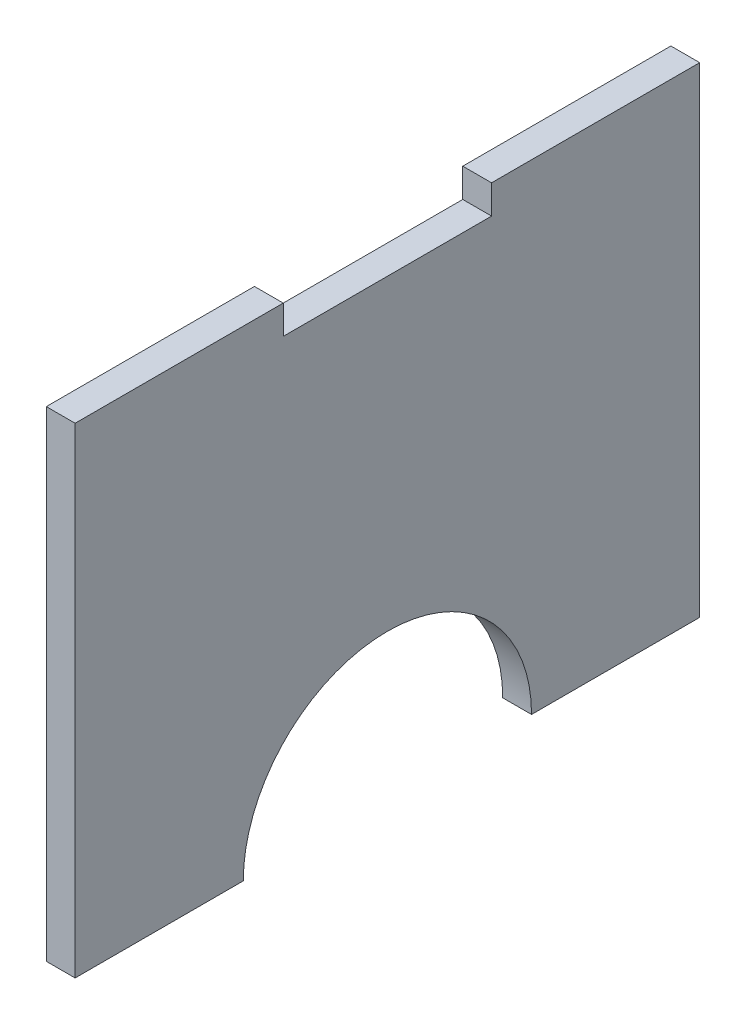
ISO-10303-21;
HEADER;
FILE_DESCRIPTION(('STEP AP214'),'2;1');
FILE_NAME('part.step','',(''),(''),'','','');
FILE_SCHEMA(('AUTOMOTIVE_DESIGN { 1 0 10303 214 1 1 1 1 }'));
ENDSEC;
DATA;
#1=APPLICATION_CONTEXT('core data for automotive mechanical design processes');
#2=APPLICATION_PROTOCOL_DEFINITION('international standard','automotive_design',2000,#1);
#3=PRODUCT_CONTEXT('',#1,'mechanical');
#4=PRODUCT('Part','Part','',(#3));
#5=PRODUCT_RELATED_PRODUCT_CATEGORY('part','',(#4));
#6=PRODUCT_DEFINITION_FORMATION('','',#4);
#7=PRODUCT_DEFINITION_CONTEXT('part definition',#1,'design');
#8=PRODUCT_DEFINITION('design','',#6,#7);
#9=PRODUCT_DEFINITION_SHAPE('','',#8);
#10=(LENGTH_UNIT() NAMED_UNIT(*) SI_UNIT(.MILLI.,.METRE.));
#11=(NAMED_UNIT(*) PLANE_ANGLE_UNIT() SI_UNIT($,.RADIAN.));
#12=(NAMED_UNIT(*) SI_UNIT($,.STERADIAN.) SOLID_ANGLE_UNIT());
#13=UNCERTAINTY_MEASURE_WITH_UNIT(LENGTH_MEASURE(1.E-05),#10,'distance_accuracy_value','');
#14=(GEOMETRIC_REPRESENTATION_CONTEXT(3) GLOBAL_UNCERTAINTY_ASSIGNED_CONTEXT((#13)) GLOBAL_UNIT_ASSIGNED_CONTEXT((#10,
#11,#12)) REPRESENTATION_CONTEXT('',''));
#15=CARTESIAN_POINT('',(0.,0.,0.));
#16=DIRECTION('',(0.,0.,1.));
#17=DIRECTION('',(1.,0.,0.));
#18=AXIS2_PLACEMENT_3D('',#15,#16,#17);
#19=CARTESIAN_POINT('',(3.,50.,32.5));
#20=DIRECTION('',(0.,-1.,0.));
#21=DIRECTION('',(0.,0.,-1.));
#22=AXIS2_PLACEMENT_3D('',#19,#20,#21);
#23=PLANE('',#22);
#24=DIRECTION('',(0.,0.,1.));
#25=VECTOR('',#24,1.);
#26=CARTESIAN_POINT('',(0.,50.,32.5));
#27=LINE('',#26,#25);
#28=CARTESIAN_POINT('',(0.,50.,10.84));
#29=VERTEX_POINT('',#28);
#30=CARTESIAN_POINT('',(0.,50.,32.5));
#31=VERTEX_POINT('',#30);
#32=EDGE_CURVE('E141',#29,#31,#27,.T.);
#33=ORIENTED_EDGE('',*,*,#32,.T.);
#34=DIRECTION('',(-1.,0.,0.));
#35=VECTOR('',#34,1.);
#36=CARTESIAN_POINT('',(3.,50.,32.5));
#37=LINE('',#36,#35);
#38=CARTESIAN_POINT('',(3.,50.,32.5));
#39=VERTEX_POINT('',#38);
#40=EDGE_CURVE('E11',#39,#31,#37,.T.);
#41=ORIENTED_EDGE('',*,*,#40,.F.);
#42=DIRECTION('',(0.,0.,1.));
#43=VECTOR('',#42,1.);
#44=CARTESIAN_POINT('',(3.,50.,32.5));
#45=LINE('',#44,#43);
#46=CARTESIAN_POINT('',(3.,50.,10.84));
#47=VERTEX_POINT('',#46);
#48=EDGE_CURVE('E159',#47,#39,#45,.T.);
#49=ORIENTED_EDGE('',*,*,#48,.F.);
#50=DIRECTION('',(-1.,0.,0.));
#51=VECTOR('',#50,1.);
#52=CARTESIAN_POINT('',(3.,50.,10.84));
#53=LINE('',#52,#51);
#54=EDGE_CURVE('E137',#47,#29,#53,.T.);
#55=ORIENTED_EDGE('',*,*,#54,.T.);
#56=EDGE_LOOP('',(#33,#41,#49,#55));
#57=FACE_BOUND('',#56,.T.);
#58=ADVANCED_FACE('F33',(#57),#23,.F.);
#59=CARTESIAN_POINT('',(3.,50.,32.5));
#60=DIRECTION('',(0.,0.,-1.));
#61=DIRECTION('',(-1.,0.,0.));
#62=AXIS2_PLACEMENT_3D('',#59,#60,#61);
#63=PLANE('',#62);
#64=DIRECTION('',(0.,-1.,0.));
#65=VECTOR('',#64,1.);
#66=CARTESIAN_POINT('',(0.,50.,32.5));
#67=LINE('',#66,#65);
#68=CARTESIAN_POINT('',(0.,0.,32.5));
#69=VERTEX_POINT('',#68);
#70=EDGE_CURVE('E144',#31,#69,#67,.T.);
#71=ORIENTED_EDGE('',*,*,#70,.T.);
#72=DIRECTION('',(-1.,0.,0.));
#73=VECTOR('',#72,1.);
#74=CARTESIAN_POINT('',(3.,0.,32.5));
#75=LINE('',#74,#73);
#76=CARTESIAN_POINT('',(3.,0.,32.5));
#77=VERTEX_POINT('',#76);
#78=EDGE_CURVE('E41',#77,#69,#75,.T.);
#79=ORIENTED_EDGE('',*,*,#78,.F.);
#80=DIRECTION('',(0.,-1.,0.));
#81=VECTOR('',#80,1.);
#82=CARTESIAN_POINT('',(3.,50.,32.5));
#83=LINE('',#82,#81);
#84=EDGE_CURVE('E98',#39,#77,#83,.T.);
#85=ORIENTED_EDGE('',*,*,#84,.F.);
#86=ORIENTED_EDGE('',*,*,#40,.T.);
#87=EDGE_LOOP('',(#71,#79,#85,#86));
#88=FACE_BOUND('',#87,.T.);
#89=ADVANCED_FACE('F208',(#88),#63,.F.);
#90=CARTESIAN_POINT('',(3.,0.,32.5));
#91=DIRECTION('',(0.,1.,0.));
#92=DIRECTION('',(0.,0.,1.));
#93=AXIS2_PLACEMENT_3D('',#90,#91,#92);
#94=PLANE('',#93);
#95=DIRECTION('',(0.,0.,-1.));
#96=VECTOR('',#95,1.);
#97=CARTESIAN_POINT('',(0.,0.,32.5));
#98=LINE('',#97,#96);
#99=CARTESIAN_POINT('',(0.,0.,15.));
#100=VERTEX_POINT('',#99);
#101=EDGE_CURVE('E146',#69,#100,#98,.T.);
#102=ORIENTED_EDGE('',*,*,#101,.T.);
#103=DIRECTION('',(-1.,0.,0.));
#104=VECTOR('',#103,1.);
#105=CARTESIAN_POINT('',(3.,0.,15.));
#106=LINE('',#105,#104);
#107=CARTESIAN_POINT('',(3.,0.,15.));
#108=VERTEX_POINT('',#107);
#109=EDGE_CURVE('E172',#108,#100,#106,.T.);
#110=ORIENTED_EDGE('',*,*,#109,.F.);
#111=DIRECTION('',(0.,0.,-1.));
#112=VECTOR('',#111,1.);
#113=CARTESIAN_POINT('',(3.,0.,32.5));
#114=LINE('',#113,#112);
#115=EDGE_CURVE('E180',#77,#108,#114,.T.);
#116=ORIENTED_EDGE('',*,*,#115,.F.);
#117=ORIENTED_EDGE('',*,*,#78,.T.);
#118=EDGE_LOOP('',(#102,#110,#116,#117));
#119=FACE_BOUND('',#118,.T.);
#120=ADVANCED_FACE('F178',(#119),#94,.F.);
#121=CARTESIAN_POINT('',(3.,0.,0.));
#122=DIRECTION('',(-1.,0.,0.));
#123=DIRECTION('',(0.,0.,1.));
#124=AXIS2_PLACEMENT_3D('',#121,#122,#123);
#125=CYLINDRICAL_SURFACE('',#124,15.);
#126=CARTESIAN_POINT('',(0.,0.,0.));
#127=DIRECTION('',(-1.,0.,0.));
#128=DIRECTION('',(0.,0.,1.));
#129=AXIS2_PLACEMENT_3D('',#126,#127,#128);
#130=CIRCLE('',#129,15.);
#131=CARTESIAN_POINT('',(0.,0.,-15.));
#132=VERTEX_POINT('',#131);
#133=EDGE_CURVE('E148',#100,#132,#130,.T.);
#134=ORIENTED_EDGE('',*,*,#133,.T.);
#135=DIRECTION('',(-1.,0.,0.));
#136=VECTOR('',#135,1.);
#137=CARTESIAN_POINT('',(3.,0.,-15.));
#138=LINE('',#137,#136);
#139=CARTESIAN_POINT('',(3.,0.,-15.));
#140=VERTEX_POINT('',#139);
#141=EDGE_CURVE('E169',#140,#132,#138,.T.);
#142=ORIENTED_EDGE('',*,*,#141,.F.);
#143=CARTESIAN_POINT('',(3.,0.,0.));
#144=DIRECTION('',(-1.,0.,0.));
#145=DIRECTION('',(0.,0.,1.));
#146=AXIS2_PLACEMENT_3D('',#143,#144,#145);
#147=CIRCLE('',#146,15.);
#148=EDGE_CURVE('E198',#108,#140,#147,.T.);
#149=ORIENTED_EDGE('',*,*,#148,.F.);
#150=ORIENTED_EDGE('',*,*,#109,.T.);
#151=EDGE_LOOP('',(#134,#142,#149,#150));
#152=FACE_BOUND('',#151,.T.);
#153=ADVANCED_FACE('F189',(#152),#125,.F.);
#154=CARTESIAN_POINT('',(3.,0.,-32.5));
#155=DIRECTION('',(0.,1.,0.));
#156=DIRECTION('',(0.,0.,1.));
#157=AXIS2_PLACEMENT_3D('',#154,#155,#156);
#158=PLANE('',#157);
#159=DIRECTION('',(0.,0.,-1.));
#160=VECTOR('',#159,1.);
#161=CARTESIAN_POINT('',(0.,0.,-32.5));
#162=LINE('',#161,#160);
#163=CARTESIAN_POINT('',(0.,0.,-32.5));
#164=VERTEX_POINT('',#163);
#165=EDGE_CURVE('E150',#132,#164,#162,.T.);
#166=ORIENTED_EDGE('',*,*,#165,.T.);
#167=DIRECTION('',(-1.,0.,0.));
#168=VECTOR('',#167,1.);
#169=CARTESIAN_POINT('',(3.,0.,-32.5));
#170=LINE('',#169,#168);
#171=CARTESIAN_POINT('',(3.,0.,-32.5));
#172=VERTEX_POINT('',#171);
#173=EDGE_CURVE('E166',#172,#164,#170,.T.);
#174=ORIENTED_EDGE('',*,*,#173,.F.);
#175=DIRECTION('',(0.,0.,-1.));
#176=VECTOR('',#175,1.);
#177=CARTESIAN_POINT('',(3.,0.,-32.5));
#178=LINE('',#177,#176);
#179=EDGE_CURVE('E195',#140,#172,#178,.T.);
#180=ORIENTED_EDGE('',*,*,#179,.F.);
#181=ORIENTED_EDGE('',*,*,#141,.T.);
#182=EDGE_LOOP('',(#166,#174,#180,#181));
#183=FACE_BOUND('',#182,.T.);
#184=ADVANCED_FACE('F193',(#183),#158,.F.);
#185=CARTESIAN_POINT('',(3.,0.,-32.5));
#186=DIRECTION('',(0.,0.,1.));
#187=DIRECTION('',(1.,0.,0.));
#188=AXIS2_PLACEMENT_3D('',#185,#186,#187);
#189=PLANE('',#188);
#190=DIRECTION('',(0.,1.,0.));
#191=VECTOR('',#190,1.);
#192=CARTESIAN_POINT('',(0.,0.,-32.5));
#193=LINE('',#192,#191);
#194=CARTESIAN_POINT('',(0.,50.,-32.5));
#195=VERTEX_POINT('',#194);
#196=EDGE_CURVE('E152',#164,#195,#193,.T.);
#197=ORIENTED_EDGE('',*,*,#196,.T.);
#198=DIRECTION('',(-1.,0.,0.));
#199=VECTOR('',#198,1.);
#200=CARTESIAN_POINT('',(3.,50.,-32.5));
#201=LINE('',#200,#199);
#202=CARTESIAN_POINT('',(3.,50.,-32.5));
#203=VERTEX_POINT('',#202);
#204=EDGE_CURVE('E163',#203,#195,#201,.T.);
#205=ORIENTED_EDGE('',*,*,#204,.F.);
#206=DIRECTION('',(0.,1.,0.));
#207=VECTOR('',#206,1.);
#208=CARTESIAN_POINT('',(3.,0.,-32.5));
#209=LINE('',#208,#207);
#210=EDGE_CURVE('E197',#172,#203,#209,.T.);
#211=ORIENTED_EDGE('',*,*,#210,.F.);
#212=ORIENTED_EDGE('',*,*,#173,.T.);
#213=EDGE_LOOP('',(#197,#205,#211,#212));
#214=FACE_BOUND('',#213,.T.);
#215=ADVANCED_FACE('F220',(#214),#189,.F.);
#216=CARTESIAN_POINT('',(3.,50.,-10.84));
#217=DIRECTION('',(0.,-1.,0.));
#218=DIRECTION('',(0.,0.,-1.));
#219=AXIS2_PLACEMENT_3D('',#216,#217,#218);
#220=PLANE('',#219);
#221=DIRECTION('',(0.,0.,1.));
#222=VECTOR('',#221,1.);
#223=CARTESIAN_POINT('',(0.,50.,-10.84));
#224=LINE('',#223,#222);
#225=CARTESIAN_POINT('',(0.,50.,-10.84));
#226=VERTEX_POINT('',#225);
#227=EDGE_CURVE('E154',#195,#226,#224,.T.);
#228=ORIENTED_EDGE('',*,*,#227,.T.);
#229=DIRECTION('',(-1.,0.,0.));
#230=VECTOR('',#229,1.);
#231=CARTESIAN_POINT('',(3.,50.,-10.84));
#232=LINE('',#231,#230);
#233=CARTESIAN_POINT('',(3.,50.,-10.84));
#234=VERTEX_POINT('',#233);
#235=EDGE_CURVE('E132',#234,#226,#232,.T.);
#236=ORIENTED_EDGE('',*,*,#235,.F.);
#237=DIRECTION('',(0.,0.,1.));
#238=VECTOR('',#237,1.);
#239=CARTESIAN_POINT('',(3.,50.,-10.84));
#240=LINE('',#239,#238);
#241=EDGE_CURVE('E123',#203,#234,#240,.T.);
#242=ORIENTED_EDGE('',*,*,#241,.F.);
#243=ORIENTED_EDGE('',*,*,#204,.T.);
#244=EDGE_LOOP('',(#228,#236,#242,#243));
#245=FACE_BOUND('',#244,.T.);
#246=ADVANCED_FACE('F223',(#245),#220,.F.);
#247=CARTESIAN_POINT('',(3.,47.,-10.84));
#248=DIRECTION('',(0.,0.,-1.));
#249=DIRECTION('',(-1.,0.,0.));
#250=AXIS2_PLACEMENT_3D('',#247,#248,#249);
#251=PLANE('',#250);
#252=DIRECTION('',(0.,-1.,0.));
#253=VECTOR('',#252,1.);
#254=CARTESIAN_POINT('',(0.,47.,-10.84));
#255=LINE('',#254,#253);
#256=CARTESIAN_POINT('',(0.,47.,-10.84));
#257=VERTEX_POINT('',#256);
#258=EDGE_CURVE('E131',#226,#257,#255,.T.);
#259=ORIENTED_EDGE('',*,*,#258,.T.);
#260=DIRECTION('',(-1.,0.,0.));
#261=VECTOR('',#260,1.);
#262=CARTESIAN_POINT('',(3.,47.,-10.84));
#263=LINE('',#262,#261);
#264=CARTESIAN_POINT('',(3.,47.,-10.84));
#265=VERTEX_POINT('',#264);
#266=EDGE_CURVE('E128',#265,#257,#263,.T.);
#267=ORIENTED_EDGE('',*,*,#266,.F.);
#268=DIRECTION('',(0.,-1.,0.));
#269=VECTOR('',#268,1.);
#270=CARTESIAN_POINT('',(3.,47.,-10.84));
#271=LINE('',#270,#269);
#272=EDGE_CURVE('E117',#234,#265,#271,.T.);
#273=ORIENTED_EDGE('',*,*,#272,.F.);
#274=ORIENTED_EDGE('',*,*,#235,.T.);
#275=EDGE_LOOP('',(#259,#267,#273,#274));
#276=FACE_BOUND('',#275,.T.);
#277=ADVANCED_FACE('F129',(#276),#251,.F.);
#278=CARTESIAN_POINT('',(3.,47.,10.84));
#279=DIRECTION('',(0.,-1.,0.));
#280=DIRECTION('',(0.,0.,-1.));
#281=AXIS2_PLACEMENT_3D('',#278,#279,#280);
#282=PLANE('',#281);
#283=DIRECTION('',(0.,0.,1.));
#284=VECTOR('',#283,1.);
#285=CARTESIAN_POINT('',(0.,47.,10.84));
#286=LINE('',#285,#284);
#287=CARTESIAN_POINT('',(0.,47.,10.84));
#288=VERTEX_POINT('',#287);
#289=EDGE_CURVE('E84',#257,#288,#286,.T.);
#290=ORIENTED_EDGE('',*,*,#289,.T.);
#291=DIRECTION('',(-1.,0.,0.));
#292=VECTOR('',#291,1.);
#293=CARTESIAN_POINT('',(3.,47.,10.84));
#294=LINE('',#293,#292);
#295=CARTESIAN_POINT('',(3.,47.,10.84));
#296=VERTEX_POINT('',#295);
#297=EDGE_CURVE('E133',#296,#288,#294,.T.);
#298=ORIENTED_EDGE('',*,*,#297,.F.);
#299=DIRECTION('',(0.,0.,1.));
#300=VECTOR('',#299,1.);
#301=CARTESIAN_POINT('',(3.,47.,10.84));
#302=LINE('',#301,#300);
#303=EDGE_CURVE('E121',#265,#296,#302,.T.);
#304=ORIENTED_EDGE('',*,*,#303,.F.);
#305=ORIENTED_EDGE('',*,*,#266,.T.);
#306=EDGE_LOOP('',(#290,#298,#304,#305));
#307=FACE_BOUND('',#306,.T.);
#308=ADVANCED_FACE('F135',(#307),#282,.F.);
#309=CARTESIAN_POINT('',(3.,50.,10.84));
#310=DIRECTION('',(0.,0.,1.));
#311=DIRECTION('',(1.,0.,0.));
#312=AXIS2_PLACEMENT_3D('',#309,#310,#311);
#313=PLANE('',#312);
#314=DIRECTION('',(0.,1.,0.));
#315=VECTOR('',#314,1.);
#316=CARTESIAN_POINT('',(0.,50.,10.84));
#317=LINE('',#316,#315);
#318=EDGE_CURVE('E90',#288,#29,#317,.T.);
#319=ORIENTED_EDGE('',*,*,#318,.T.);
#320=ORIENTED_EDGE('',*,*,#54,.F.);
#321=DIRECTION('',(0.,1.,0.));
#322=VECTOR('',#321,1.);
#323=CARTESIAN_POINT('',(3.,50.,10.84));
#324=LINE('',#323,#322);
#325=EDGE_CURVE('E49',#296,#47,#324,.T.);
#326=ORIENTED_EDGE('',*,*,#325,.F.);
#327=ORIENTED_EDGE('',*,*,#297,.T.);
#328=EDGE_LOOP('',(#319,#320,#326,#327));
#329=FACE_BOUND('',#328,.T.);
#330=ADVANCED_FACE('F232',(#329),#313,.F.);
#331=CARTESIAN_POINT('',(3.,0.,0.));
#332=DIRECTION('',(-1.,0.,0.));
#333=DIRECTION('',(0.,0.,1.));
#334=AXIS2_PLACEMENT_3D('',#331,#332,#333);
#335=PLANE('',#334);
#336=ORIENTED_EDGE('',*,*,#48,.T.);
#337=ORIENTED_EDGE('',*,*,#84,.T.);
#338=ORIENTED_EDGE('',*,*,#115,.T.);
#339=ORIENTED_EDGE('',*,*,#148,.T.);
#340=ORIENTED_EDGE('',*,*,#179,.T.);
#341=ORIENTED_EDGE('',*,*,#210,.T.);
#342=ORIENTED_EDGE('',*,*,#241,.T.);
#343=ORIENTED_EDGE('',*,*,#272,.T.);
#344=ORIENTED_EDGE('',*,*,#303,.T.);
#345=ORIENTED_EDGE('',*,*,#325,.T.);
#346=EDGE_LOOP('',(#336,#337,#338,#339,#340,#341,#342,#343,#344,#345));
#347=FACE_BOUND('',#346,.T.);
#348=ADVANCED_FACE('F119',(#347),#335,.F.);
#349=CARTESIAN_POINT('',(0.,0.,0.));
#350=DIRECTION('',(-1.,0.,0.));
#351=DIRECTION('',(0.,0.,1.));
#352=AXIS2_PLACEMENT_3D('',#349,#350,#351);
#353=PLANE('',#352);
#354=ORIENTED_EDGE('',*,*,#32,.F.);
#355=ORIENTED_EDGE('',*,*,#318,.F.);
#356=ORIENTED_EDGE('',*,*,#289,.F.);
#357=ORIENTED_EDGE('',*,*,#258,.F.);
#358=ORIENTED_EDGE('',*,*,#227,.F.);
#359=ORIENTED_EDGE('',*,*,#196,.F.);
#360=ORIENTED_EDGE('',*,*,#165,.F.);
#361=ORIENTED_EDGE('',*,*,#133,.F.);
#362=ORIENTED_EDGE('',*,*,#101,.F.);
#363=ORIENTED_EDGE('',*,*,#70,.F.);
#364=EDGE_LOOP('',(#354,#355,#356,#357,#358,#359,#360,#361,#362,#363));
#365=FACE_BOUND('',#364,.T.);
#366=ADVANCED_FACE('F184',(#365),#353,.T.);
#367=CLOSED_SHELL('',(#58,#89,#120,#153,#184,#215,#246,#277,#308,#330,#348,#366));
#368=MANIFOLD_SOLID_BREP('B2',#367);
#369=ADVANCED_BREP_SHAPE_REPRESENTATION('',(#18,#368),#14);
#370=SHAPE_DEFINITION_REPRESENTATION(#9,#369);
ENDSEC;
END-ISO-10303-21;
